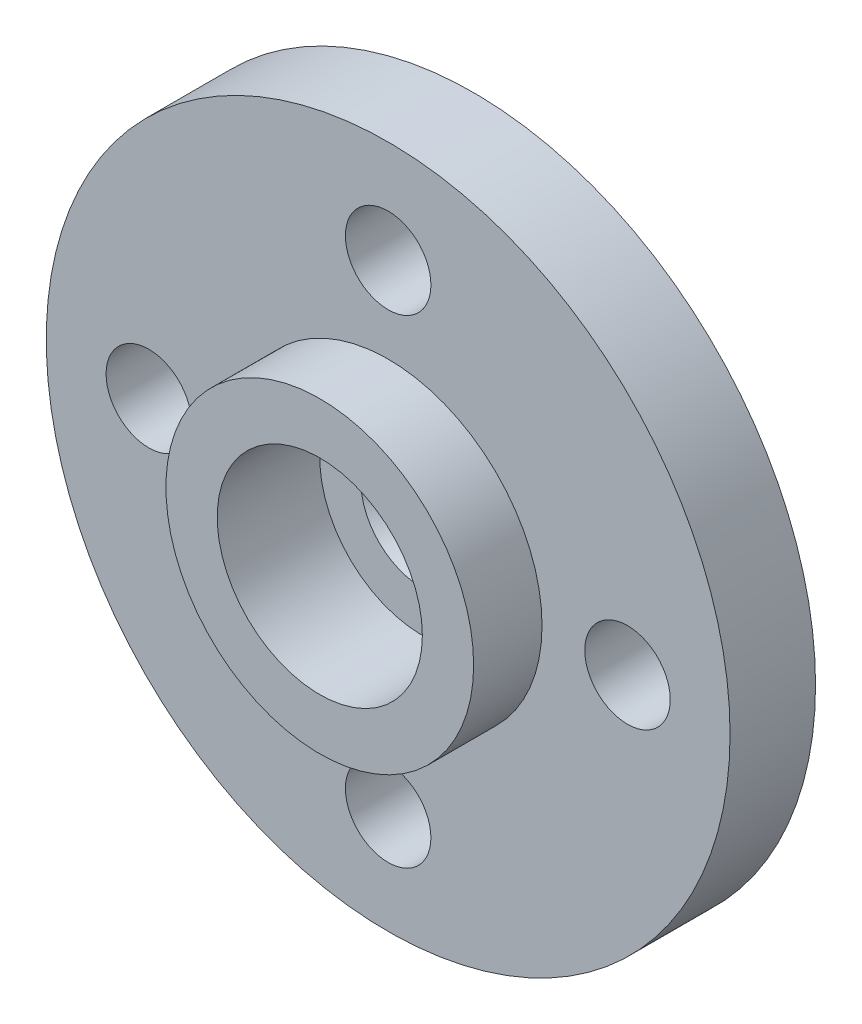
ISO-10303-21;
HEADER;
FILE_DESCRIPTION(('STEP AP214'),'2;1');
FILE_NAME('part.step','',(''),(''),'','','');
FILE_SCHEMA(('AUTOMOTIVE_DESIGN { 1 0 10303 214 1 1 1 1 }'));
ENDSEC;
DATA;
#1=APPLICATION_CONTEXT('core data for automotive mechanical design processes');
#2=APPLICATION_PROTOCOL_DEFINITION('international standard','automotive_design',2000,#1);
#3=PRODUCT_CONTEXT('',#1,'mechanical');
#4=PRODUCT('Part','Part','',(#3));
#5=PRODUCT_RELATED_PRODUCT_CATEGORY('part','',(#4));
#6=PRODUCT_DEFINITION_FORMATION('','',#4);
#7=PRODUCT_DEFINITION_CONTEXT('part definition',#1,'design');
#8=PRODUCT_DEFINITION('design','',#6,#7);
#9=PRODUCT_DEFINITION_SHAPE('','',#8);
#10=(LENGTH_UNIT() NAMED_UNIT(*) SI_UNIT(.MILLI.,.METRE.));
#11=(NAMED_UNIT(*) PLANE_ANGLE_UNIT() SI_UNIT($,.RADIAN.));
#12=(NAMED_UNIT(*) SI_UNIT($,.STERADIAN.) SOLID_ANGLE_UNIT());
#13=UNCERTAINTY_MEASURE_WITH_UNIT(LENGTH_MEASURE(1.E-05),#10,'distance_accuracy_value','');
#14=(GEOMETRIC_REPRESENTATION_CONTEXT(3) GLOBAL_UNCERTAINTY_ASSIGNED_CONTEXT((#13)) GLOBAL_UNIT_ASSIGNED_CONTEXT((#10,
#11,#12)) REPRESENTATION_CONTEXT('',''));
#15=CARTESIAN_POINT('',(0.,0.,0.));
#16=DIRECTION('',(0.,0.,1.));
#17=DIRECTION('',(1.,0.,0.));
#18=AXIS2_PLACEMENT_3D('',#15,#16,#17);
#19=CARTESIAN_POINT('',(0.,0.,2.5));
#20=DIRECTION('',(0.,0.,-1.));
#21=DIRECTION('',(-1.,0.,0.));
#22=AXIS2_PLACEMENT_3D('',#19,#20,#21);
#23=CYLINDRICAL_SURFACE('',#22,1.5);
#24=CARTESIAN_POINT('',(0.,0.,1.2));
#25=DIRECTION('',(0.,0.,1.));
#26=DIRECTION('',(1.,0.,0.));
#27=AXIS2_PLACEMENT_3D('',#24,#25,#26);
#28=CIRCLE('',#27,1.5);
#29=CARTESIAN_POINT('',(1.5,0.,1.2));
#30=VERTEX_POINT('',#29);
#31=EDGE_CURVE('E54',#30,#30,#28,.T.);
#32=ORIENTED_EDGE('',*,*,#31,.T.);
#33=EDGE_LOOP('',(#32));
#34=FACE_BOUND('',#33,.T.);
#35=CARTESIAN_POINT('',(0.,0.,0.));
#36=DIRECTION('',(0.,0.,1.));
#37=DIRECTION('',(1.,0.,0.));
#38=AXIS2_PLACEMENT_3D('',#35,#36,#37);
#39=CIRCLE('',#38,1.5);
#40=CARTESIAN_POINT('',(1.5,0.,0.));
#41=VERTEX_POINT('',#40);
#42=EDGE_CURVE('E69',#41,#41,#39,.T.);
#43=ORIENTED_EDGE('',*,*,#42,.F.);
#44=EDGE_LOOP('',(#43));
#45=FACE_BOUND('',#44,.T.);
#46=ADVANCED_FACE('F45',(#34,#45),#23,.F.);
#47=CARTESIAN_POINT('',(0.,0.,2.5));
#48=DIRECTION('',(0.,0.,1.));
#49=DIRECTION('',(1.,0.,0.));
#50=AXIS2_PLACEMENT_3D('',#47,#48,#49);
#51=PLANE('',#50);
#52=CARTESIAN_POINT('',(0.,7.,2.5));
#53=DIRECTION('',(0.,0.,1.));
#54=DIRECTION('',(1.,0.,0.));
#55=AXIS2_PLACEMENT_3D('',#52,#53,#54);
#56=CIRCLE('',#55,1.24999999999999);
#57=CARTESIAN_POINT('',(1.24999999999999,7.,2.5));
#58=VERTEX_POINT('',#57);
#59=EDGE_CURVE('E114',#58,#58,#56,.T.);
#60=ORIENTED_EDGE('',*,*,#59,.F.);
#61=EDGE_LOOP('',(#60));
#62=FACE_BOUND('',#61,.T.);
#63=CARTESIAN_POINT('',(-7.,0.,2.5));
#64=DIRECTION('',(0.,0.,1.));
#65=DIRECTION('',(1.,0.,0.));
#66=AXIS2_PLACEMENT_3D('',#63,#64,#65);
#67=CIRCLE('',#66,1.24999999999999);
#68=CARTESIAN_POINT('',(-5.75000000000001,0.,2.5));
#69=VERTEX_POINT('',#68);
#70=EDGE_CURVE('E106',#69,#69,#67,.T.);
#71=ORIENTED_EDGE('',*,*,#70,.F.);
#72=EDGE_LOOP('',(#71));
#73=FACE_BOUND('',#72,.T.);
#74=CARTESIAN_POINT('',(0.,-7.,2.5));
#75=DIRECTION('',(0.,0.,1.));
#76=DIRECTION('',(1.,0.,0.));
#77=AXIS2_PLACEMENT_3D('',#74,#75,#76);
#78=CIRCLE('',#77,1.24999999999999);
#79=CARTESIAN_POINT('',(1.24999999999999,-7.,2.5));
#80=VERTEX_POINT('',#79);
#81=EDGE_CURVE('E98',#80,#80,#78,.T.);
#82=ORIENTED_EDGE('',*,*,#81,.F.);
#83=EDGE_LOOP('',(#82));
#84=FACE_BOUND('',#83,.T.);
#85=CARTESIAN_POINT('',(7.,0.,2.5));
#86=DIRECTION('',(0.,0.,1.));
#87=DIRECTION('',(1.,0.,0.));
#88=AXIS2_PLACEMENT_3D('',#85,#86,#87);
#89=CIRCLE('',#88,1.24999999999999);
#90=CARTESIAN_POINT('',(8.24999999999999,0.,2.5));
#91=VERTEX_POINT('',#90);
#92=EDGE_CURVE('E90',#91,#91,#89,.T.);
#93=ORIENTED_EDGE('',*,*,#92,.F.);
#94=EDGE_LOOP('',(#93));
#95=FACE_BOUND('',#94,.T.);
#96=CARTESIAN_POINT('',(0.,0.,2.5));
#97=DIRECTION('',(0.,0.,1.));
#98=DIRECTION('',(1.,0.,0.));
#99=AXIS2_PLACEMENT_3D('',#96,#97,#98);
#100=CIRCLE('',#99,4.5);
#101=CARTESIAN_POINT('',(4.5,0.,2.5));
#102=VERTEX_POINT('',#101);
#103=EDGE_CURVE('E75',#102,#102,#100,.T.);
#104=ORIENTED_EDGE('',*,*,#103,.F.);
#105=EDGE_LOOP('',(#104));
#106=FACE_BOUND('',#105,.T.);
#107=CARTESIAN_POINT('',(0.,0.,2.5));
#108=DIRECTION('',(0.,0.,1.));
#109=DIRECTION('',(1.,0.,0.));
#110=AXIS2_PLACEMENT_3D('',#107,#108,#109);
#111=CIRCLE('',#110,10.);
#112=CARTESIAN_POINT('',(10.,0.,2.5));
#113=VERTEX_POINT('',#112);
#114=EDGE_CURVE('E59',#113,#113,#111,.T.);
#115=ORIENTED_EDGE('',*,*,#114,.T.);
#116=EDGE_LOOP('',(#115));
#117=FACE_BOUND('',#116,.T.);
#118=ADVANCED_FACE('F129',(#62,#73,#84,#95,#106,#117),#51,.T.);
#119=CARTESIAN_POINT('',(0.,0.,0.));
#120=DIRECTION('',(0.,0.,1.));
#121=DIRECTION('',(1.,0.,0.));
#122=AXIS2_PLACEMENT_3D('',#119,#120,#121);
#123=PLANE('',#122);
#124=CARTESIAN_POINT('',(0.,7.,0.));
#125=DIRECTION('',(0.,0.,-1.));
#126=DIRECTION('',(-1.,0.,0.));
#127=AXIS2_PLACEMENT_3D('',#124,#125,#126);
#128=CIRCLE('',#127,1.24999999999999);
#129=CARTESIAN_POINT('',(-1.24999999999999,7.,0.));
#130=VERTEX_POINT('',#129);
#131=EDGE_CURVE('E118',#130,#130,#128,.T.);
#132=ORIENTED_EDGE('',*,*,#131,.F.);
#133=EDGE_LOOP('',(#132));
#134=FACE_BOUND('',#133,.T.);
#135=CARTESIAN_POINT('',(-7.,0.,0.));
#136=DIRECTION('',(0.,0.,-1.));
#137=DIRECTION('',(-1.,0.,0.));
#138=AXIS2_PLACEMENT_3D('',#135,#136,#137);
#139=CIRCLE('',#138,1.24999999999999);
#140=CARTESIAN_POINT('',(-8.24999999999999,0.,0.));
#141=VERTEX_POINT('',#140);
#142=EDGE_CURVE('E110',#141,#141,#139,.T.);
#143=ORIENTED_EDGE('',*,*,#142,.F.);
#144=EDGE_LOOP('',(#143));
#145=FACE_BOUND('',#144,.T.);
#146=CARTESIAN_POINT('',(0.,-7.,0.));
#147=DIRECTION('',(0.,0.,-1.));
#148=DIRECTION('',(-1.,0.,0.));
#149=AXIS2_PLACEMENT_3D('',#146,#147,#148);
#150=CIRCLE('',#149,1.24999999999999);
#151=CARTESIAN_POINT('',(-1.24999999999999,-7.,0.));
#152=VERTEX_POINT('',#151);
#153=EDGE_CURVE('E102',#152,#152,#150,.T.);
#154=ORIENTED_EDGE('',*,*,#153,.F.);
#155=EDGE_LOOP('',(#154));
#156=FACE_BOUND('',#155,.T.);
#157=CARTESIAN_POINT('',(7.,0.,0.));
#158=DIRECTION('',(0.,0.,-1.));
#159=DIRECTION('',(-1.,0.,0.));
#160=AXIS2_PLACEMENT_3D('',#157,#158,#159);
#161=CIRCLE('',#160,1.24999999999999);
#162=CARTESIAN_POINT('',(5.75000000000001,0.,0.));
#163=VERTEX_POINT('',#162);
#164=EDGE_CURVE('E94',#163,#163,#161,.T.);
#165=ORIENTED_EDGE('',*,*,#164,.F.);
#166=EDGE_LOOP('',(#165));
#167=FACE_BOUND('',#166,.T.);
#168=CARTESIAN_POINT('',(0.,0.,0.));
#169=DIRECTION('',(0.,0.,1.));
#170=DIRECTION('',(1.,0.,0.));
#171=AXIS2_PLACEMENT_3D('',#168,#169,#170);
#172=CIRCLE('',#171,10.);
#173=CARTESIAN_POINT('',(10.,0.,0.));
#174=VERTEX_POINT('',#173);
#175=EDGE_CURVE('E64',#174,#174,#172,.T.);
#176=ORIENTED_EDGE('',*,*,#175,.F.);
#177=EDGE_LOOP('',(#176));
#178=FACE_BOUND('',#177,.T.);
#179=ORIENTED_EDGE('',*,*,#42,.T.);
#180=EDGE_LOOP('',(#179));
#181=FACE_BOUND('',#180,.T.);
#182=ADVANCED_FACE('F125',(#134,#145,#156,#167,#178,#181),#123,.F.);
#183=CARTESIAN_POINT('',(0.,0.,2.5));
#184=DIRECTION('',(0.,0.,-1.));
#185=DIRECTION('',(-1.,0.,0.));
#186=AXIS2_PLACEMENT_3D('',#183,#184,#185);
#187=CYLINDRICAL_SURFACE('',#186,10.);
#188=ORIENTED_EDGE('',*,*,#114,.F.);
#189=EDGE_LOOP('',(#188));
#190=FACE_BOUND('',#189,.T.);
#191=ORIENTED_EDGE('',*,*,#175,.T.);
#192=EDGE_LOOP('',(#191));
#193=FACE_BOUND('',#192,.T.);
#194=ADVANCED_FACE('F128',(#190,#193),#187,.T.);
#195=CARTESIAN_POINT('',(0.,0.,4.5));
#196=DIRECTION('',(0.,0.,1.));
#197=DIRECTION('',(1.,0.,0.));
#198=AXIS2_PLACEMENT_3D('',#195,#196,#197);
#199=PLANE('',#198);
#200=CARTESIAN_POINT('',(0.,0.,4.5));
#201=DIRECTION('',(0.,0.,1.));
#202=DIRECTION('',(1.,0.,0.));
#203=AXIS2_PLACEMENT_3D('',#200,#201,#202);
#204=CIRCLE('',#203,4.5);
#205=CARTESIAN_POINT('',(4.5,0.,4.5));
#206=VERTEX_POINT('',#205);
#207=EDGE_CURVE('E74',#206,#206,#204,.T.);
#208=ORIENTED_EDGE('',*,*,#207,.T.);
#209=EDGE_LOOP('',(#208));
#210=FACE_BOUND('',#209,.T.);
#211=CARTESIAN_POINT('',(0.,0.,4.5));
#212=DIRECTION('',(0.,0.,1.));
#213=DIRECTION('',(1.,0.,0.));
#214=AXIS2_PLACEMENT_3D('',#211,#212,#213);
#215=CIRCLE('',#214,3.);
#216=CARTESIAN_POINT('',(3.,0.,4.5));
#217=VERTEX_POINT('',#216);
#218=EDGE_CURVE('E79',#217,#217,#215,.T.);
#219=ORIENTED_EDGE('',*,*,#218,.F.);
#220=EDGE_LOOP('',(#219));
#221=FACE_BOUND('',#220,.T.);
#222=ADVANCED_FACE('F152',(#210,#221),#199,.T.);
#223=CARTESIAN_POINT('',(0.,0.,4.5));
#224=DIRECTION('',(0.,0.,-1.));
#225=DIRECTION('',(-1.,0.,0.));
#226=AXIS2_PLACEMENT_3D('',#223,#224,#225);
#227=CYLINDRICAL_SURFACE('',#226,4.5);
#228=ORIENTED_EDGE('',*,*,#207,.F.);
#229=EDGE_LOOP('',(#228));
#230=FACE_BOUND('',#229,.T.);
#231=ORIENTED_EDGE('',*,*,#103,.T.);
#232=EDGE_LOOP('',(#231));
#233=FACE_BOUND('',#232,.T.);
#234=ADVANCED_FACE('F149',(#230,#233),#227,.T.);
#235=CARTESIAN_POINT('',(0.,0.,4.5));
#236=DIRECTION('',(0.,0.,-1.));
#237=DIRECTION('',(-1.,0.,0.));
#238=AXIS2_PLACEMENT_3D('',#235,#236,#237);
#239=CYLINDRICAL_SURFACE('',#238,3.);
#240=ORIENTED_EDGE('',*,*,#218,.T.);
#241=EDGE_LOOP('',(#240));
#242=FACE_BOUND('',#241,.T.);
#243=CARTESIAN_POINT('',(0.,0.,1.5));
#244=DIRECTION('',(0.,0.,1.));
#245=DIRECTION('',(1.,0.,0.));
#246=AXIS2_PLACEMENT_3D('',#243,#244,#245);
#247=CIRCLE('',#246,3.);
#248=CARTESIAN_POINT('',(3.,0.,1.5));
#249=VERTEX_POINT('',#248);
#250=EDGE_CURVE('E86',#249,#249,#247,.T.);
#251=ORIENTED_EDGE('',*,*,#250,.F.);
#252=EDGE_LOOP('',(#251));
#253=FACE_BOUND('',#252,.T.);
#254=ADVANCED_FACE('F164',(#242,#253),#239,.F.);
#255=CARTESIAN_POINT('',(0.,0.,1.5));
#256=DIRECTION('',(0.,0.,1.));
#257=DIRECTION('',(1.,0.,0.));
#258=AXIS2_PLACEMENT_3D('',#255,#256,#257);
#259=PLANE('',#258);
#260=CARTESIAN_POINT('',(0.,0.,1.5));
#261=DIRECTION('',(0.,0.,1.));
#262=DIRECTION('',(1.,0.,0.));
#263=AXIS2_PLACEMENT_3D('',#260,#261,#262);
#264=CIRCLE('',#263,1.8);
#265=CARTESIAN_POINT('',(1.8,0.,1.5));
#266=VERTEX_POINT('',#265);
#267=EDGE_CURVE('E10',#266,#266,#264,.F.);
#268=ORIENTED_EDGE('',*,*,#267,.T.);
#269=EDGE_LOOP('',(#268));
#270=FACE_BOUND('',#269,.T.);
#271=ORIENTED_EDGE('',*,*,#250,.T.);
#272=EDGE_LOOP('',(#271));
#273=FACE_BOUND('',#272,.T.);
#274=ADVANCED_FACE('F170',(#270,#273),#259,.T.);
#275=CARTESIAN_POINT('',(0.,0.,1.2));
#276=DIRECTION('',(0.,0.,1.));
#277=DIRECTION('',(1.,0.,0.));
#278=AXIS2_PLACEMENT_3D('',#275,#276,#277);
#279=CONICAL_SURFACE('',#278,1.5,0.78539816339745);
#280=ORIENTED_EDGE('',*,*,#267,.F.);
#281=EDGE_LOOP('',(#280));
#282=FACE_BOUND('',#281,.T.);
#283=ORIENTED_EDGE('',*,*,#31,.F.);
#284=EDGE_LOOP('',(#283));
#285=FACE_BOUND('',#284,.T.);
#286=ADVANCED_FACE('F48',(#282,#285),#279,.F.);
#287=CARTESIAN_POINT('',(7.,0.,0.));
#288=DIRECTION('',(0.,0.,-1.));
#289=DIRECTION('',(-1.,0.,0.));
#290=AXIS2_PLACEMENT_3D('',#287,#288,#289);
#291=CYLINDRICAL_SURFACE('',#290,1.24999999999999);
#292=ORIENTED_EDGE('',*,*,#92,.T.);
#293=EDGE_LOOP('',(#292));
#294=FACE_BOUND('',#293,.T.);
#295=ORIENTED_EDGE('',*,*,#164,.T.);
#296=EDGE_LOOP('',(#295));
#297=FACE_BOUND('',#296,.T.);
#298=ADVANCED_FACE('F174',(#294,#297),#291,.F.);
#299=CARTESIAN_POINT('',(0.,-7.,0.));
#300=DIRECTION('',(0.,0.,-1.));
#301=DIRECTION('',(-1.,0.,0.));
#302=AXIS2_PLACEMENT_3D('',#299,#300,#301);
#303=CYLINDRICAL_SURFACE('',#302,1.24999999999999);
#304=ORIENTED_EDGE('',*,*,#81,.T.);
#305=EDGE_LOOP('',(#304));
#306=FACE_BOUND('',#305,.T.);
#307=ORIENTED_EDGE('',*,*,#153,.T.);
#308=EDGE_LOOP('',(#307));
#309=FACE_BOUND('',#308,.T.);
#310=ADVANCED_FACE('F177',(#306,#309),#303,.F.);
#311=CARTESIAN_POINT('',(-7.,0.,0.));
#312=DIRECTION('',(0.,0.,-1.));
#313=DIRECTION('',(-1.,0.,0.));
#314=AXIS2_PLACEMENT_3D('',#311,#312,#313);
#315=CYLINDRICAL_SURFACE('',#314,1.24999999999999);
#316=ORIENTED_EDGE('',*,*,#70,.T.);
#317=EDGE_LOOP('',(#316));
#318=FACE_BOUND('',#317,.T.);
#319=ORIENTED_EDGE('',*,*,#142,.T.);
#320=EDGE_LOOP('',(#319));
#321=FACE_BOUND('',#320,.T.);
#322=ADVANCED_FACE('F181',(#318,#321),#315,.F.);
#323=CARTESIAN_POINT('',(0.,7.,0.));
#324=DIRECTION('',(0.,0.,-1.));
#325=DIRECTION('',(-1.,0.,0.));
#326=AXIS2_PLACEMENT_3D('',#323,#324,#325);
#327=CYLINDRICAL_SURFACE('',#326,1.24999999999999);
#328=ORIENTED_EDGE('',*,*,#59,.T.);
#329=EDGE_LOOP('',(#328));
#330=FACE_BOUND('',#329,.T.);
#331=ORIENTED_EDGE('',*,*,#131,.T.);
#332=EDGE_LOOP('',(#331));
#333=FACE_BOUND('',#332,.T.);
#334=ADVANCED_FACE('F123',(#330,#333),#327,.F.);
#335=CLOSED_SHELL('',(#46,#118,#182,#194,#222,#234,#254,#274,#286,#298,#310,#322,#334));
#336=MANIFOLD_SOLID_BREP('B2',#335);
#337=ADVANCED_BREP_SHAPE_REPRESENTATION('',(#18,#336),#14);
#338=SHAPE_DEFINITION_REPRESENTATION(#9,#337);
ENDSEC;
END-ISO-10303-21;
